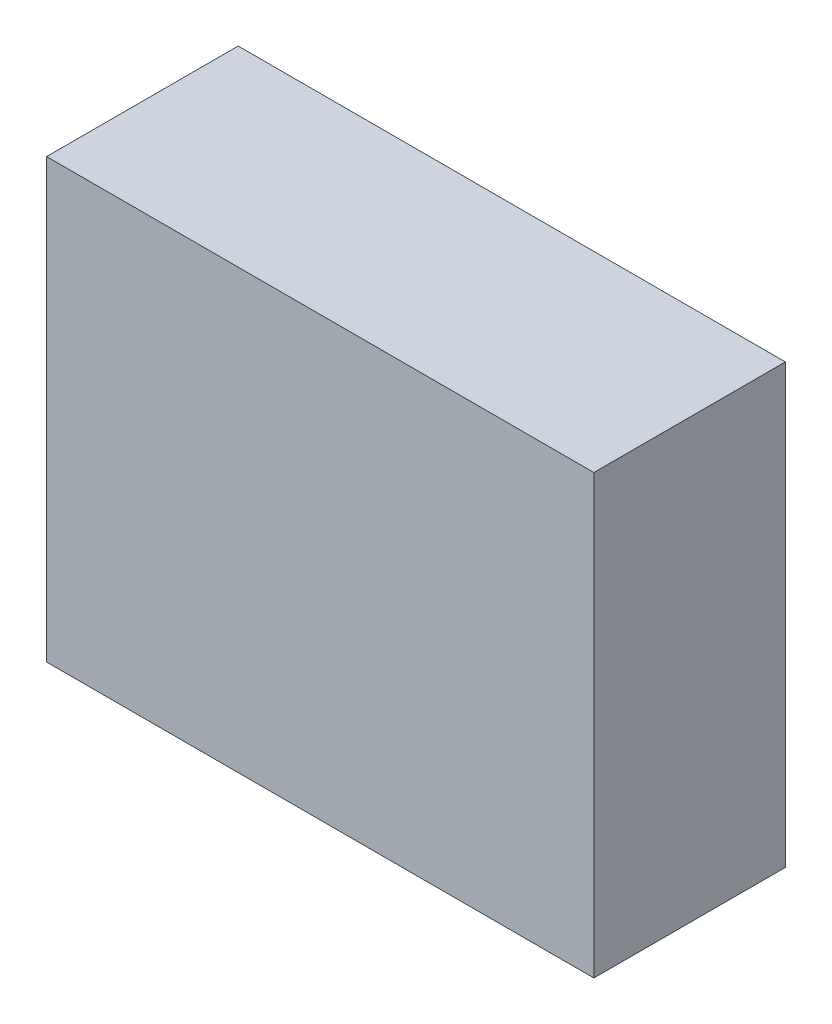
ISO-10303-21;
HEADER;
FILE_DESCRIPTION(('STEP AP214'),'2;1');
FILE_NAME('part.step','',(''),(''),'','','');
FILE_SCHEMA(('AUTOMOTIVE_DESIGN { 1 0 10303 214 1 1 1 1 }'));
ENDSEC;
DATA;
#1=APPLICATION_CONTEXT('core data for automotive mechanical design processes');
#2=APPLICATION_PROTOCOL_DEFINITION('international standard','automotive_design',2000,#1);
#3=PRODUCT_CONTEXT('',#1,'mechanical');
#4=PRODUCT('Part','Part','',(#3));
#5=PRODUCT_RELATED_PRODUCT_CATEGORY('part','',(#4));
#6=PRODUCT_DEFINITION_FORMATION('','',#4);
#7=PRODUCT_DEFINITION_CONTEXT('part definition',#1,'design');
#8=PRODUCT_DEFINITION('design','',#6,#7);
#9=PRODUCT_DEFINITION_SHAPE('','',#8);
#10=(LENGTH_UNIT() NAMED_UNIT(*) SI_UNIT(.MILLI.,.METRE.));
#11=(NAMED_UNIT(*) PLANE_ANGLE_UNIT() SI_UNIT($,.RADIAN.));
#12=(NAMED_UNIT(*) SI_UNIT($,.STERADIAN.) SOLID_ANGLE_UNIT());
#13=UNCERTAINTY_MEASURE_WITH_UNIT(LENGTH_MEASURE(1.E-05),#10,'distance_accuracy_value','');
#14=(GEOMETRIC_REPRESENTATION_CONTEXT(3) GLOBAL_UNCERTAINTY_ASSIGNED_CONTEXT((#13)) GLOBAL_UNIT_ASSIGNED_CONTEXT((#10,
#11,#12)) REPRESENTATION_CONTEXT('',''));
#15=CARTESIAN_POINT('',(0.,0.,0.));
#16=DIRECTION('',(0.,0.,1.));
#17=DIRECTION('',(1.,0.,0.));
#18=AXIS2_PLACEMENT_3D('',#15,#16,#17);
#19=CARTESIAN_POINT('',(10.,-2.,-20.8));
#20=DIRECTION('',(1.,0.,0.));
#21=DIRECTION('',(0.,0.,-1.));
#22=AXIS2_PLACEMENT_3D('',#19,#20,#21);
#23=PLANE('',#22);
#24=DIRECTION('',(0.,-1.,0.));
#25=VECTOR('',#24,1.);
#26=CARTESIAN_POINT('',(10.,-2.,-22.55));
#27=LINE('',#26,#25);
#28=CARTESIAN_POINT('',(10.,2.,-22.55));
#29=VERTEX_POINT('',#28);
#30=CARTESIAN_POINT('',(10.,-2.,-22.55));
#31=VERTEX_POINT('',#30);
#32=EDGE_CURVE('E105',#29,#31,#27,.T.);
#33=ORIENTED_EDGE('',*,*,#32,.T.);
#34=DIRECTION('',(0.,0.,-1.));
#35=VECTOR('',#34,1.);
#36=CARTESIAN_POINT('',(10.,-2.,-20.8));
#37=LINE('',#36,#35);
#38=CARTESIAN_POINT('',(10.,-2.,-20.8));
#39=VERTEX_POINT('',#38);
#40=EDGE_CURVE('E11',#39,#31,#37,.T.);
#41=ORIENTED_EDGE('',*,*,#40,.F.);
#42=DIRECTION('',(0.,-1.,0.));
#43=VECTOR('',#42,1.);
#44=CARTESIAN_POINT('',(10.,-2.,-20.8));
#45=LINE('',#44,#43);
#46=CARTESIAN_POINT('',(10.,2.,-20.8));
#47=VERTEX_POINT('',#46);
#48=EDGE_CURVE('E89',#47,#39,#45,.T.);
#49=ORIENTED_EDGE('',*,*,#48,.F.);
#50=DIRECTION('',(0.,0.,-1.));
#51=VECTOR('',#50,1.);
#52=CARTESIAN_POINT('',(10.,2.,-20.8));
#53=LINE('',#52,#51);
#54=EDGE_CURVE('E97',#47,#29,#53,.T.);
#55=ORIENTED_EDGE('',*,*,#54,.T.);
#56=EDGE_LOOP('',(#33,#41,#49,#55));
#57=FACE_BOUND('',#56,.T.);
#58=ADVANCED_FACE('F39',(#57),#23,.F.);
#59=CARTESIAN_POINT('',(10.,-2.,-20.8));
#60=DIRECTION('',(0.,1.,0.));
#61=DIRECTION('',(0.,0.,1.));
#62=AXIS2_PLACEMENT_3D('',#59,#60,#61);
#63=PLANE('',#62);
#64=DIRECTION('',(1.,0.,0.));
#65=VECTOR('',#64,1.);
#66=CARTESIAN_POINT('',(10.,-2.,-22.55));
#67=LINE('',#66,#65);
#68=CARTESIAN_POINT('',(15.,-2.,-22.55));
#69=VERTEX_POINT('',#68);
#70=EDGE_CURVE('E92',#31,#69,#67,.T.);
#71=ORIENTED_EDGE('',*,*,#70,.T.);
#72=DIRECTION('',(0.,0.,-1.));
#73=VECTOR('',#72,1.);
#74=CARTESIAN_POINT('',(15.,-2.,-20.8));
#75=LINE('',#74,#73);
#76=CARTESIAN_POINT('',(15.,-2.,-20.8));
#77=VERTEX_POINT('',#76);
#78=EDGE_CURVE('E50',#77,#69,#75,.T.);
#79=ORIENTED_EDGE('',*,*,#78,.F.);
#80=DIRECTION('',(1.,0.,0.));
#81=VECTOR('',#80,1.);
#82=CARTESIAN_POINT('',(10.,-2.,-20.8));
#83=LINE('',#82,#81);
#84=EDGE_CURVE('E82',#39,#77,#83,.T.);
#85=ORIENTED_EDGE('',*,*,#84,.F.);
#86=ORIENTED_EDGE('',*,*,#40,.T.);
#87=EDGE_LOOP('',(#71,#79,#85,#86));
#88=FACE_BOUND('',#87,.T.);
#89=ADVANCED_FACE('F93',(#88),#63,.F.);
#90=CARTESIAN_POINT('',(15.,-2.,-20.8));
#91=DIRECTION('',(-1.,0.,0.));
#92=DIRECTION('',(0.,0.,1.));
#93=AXIS2_PLACEMENT_3D('',#90,#91,#92);
#94=PLANE('',#93);
#95=DIRECTION('',(0.,1.,0.));
#96=VECTOR('',#95,1.);
#97=CARTESIAN_POINT('',(15.,-2.,-22.55));
#98=LINE('',#97,#96);
#99=CARTESIAN_POINT('',(15.,2.,-22.55));
#100=VERTEX_POINT('',#99);
#101=EDGE_CURVE('E74',#69,#100,#98,.T.);
#102=ORIENTED_EDGE('',*,*,#101,.T.);
#103=DIRECTION('',(0.,0.,-1.));
#104=VECTOR('',#103,1.);
#105=CARTESIAN_POINT('',(15.,2.,-20.8));
#106=LINE('',#105,#104);
#107=CARTESIAN_POINT('',(15.,2.,-20.8));
#108=VERTEX_POINT('',#107);
#109=EDGE_CURVE('E94',#108,#100,#106,.T.);
#110=ORIENTED_EDGE('',*,*,#109,.F.);
#111=DIRECTION('',(0.,1.,0.));
#112=VECTOR('',#111,1.);
#113=CARTESIAN_POINT('',(15.,-2.,-20.8));
#114=LINE('',#113,#112);
#115=EDGE_CURVE('E88',#77,#108,#114,.T.);
#116=ORIENTED_EDGE('',*,*,#115,.F.);
#117=ORIENTED_EDGE('',*,*,#78,.T.);
#118=EDGE_LOOP('',(#102,#110,#116,#117));
#119=FACE_BOUND('',#118,.T.);
#120=ADVANCED_FACE('F96',(#119),#94,.F.);
#121=CARTESIAN_POINT('',(10.,2.,-20.8));
#122=DIRECTION('',(0.,-1.,0.));
#123=DIRECTION('',(0.,0.,-1.));
#124=AXIS2_PLACEMENT_3D('',#121,#122,#123);
#125=PLANE('',#124);
#126=DIRECTION('',(-1.,0.,0.));
#127=VECTOR('',#126,1.);
#128=CARTESIAN_POINT('',(10.,2.,-22.55));
#129=LINE('',#128,#127);
#130=EDGE_CURVE('E76',#100,#29,#129,.T.);
#131=ORIENTED_EDGE('',*,*,#130,.T.);
#132=ORIENTED_EDGE('',*,*,#54,.F.);
#133=DIRECTION('',(-1.,0.,0.));
#134=VECTOR('',#133,1.);
#135=CARTESIAN_POINT('',(10.,2.,-20.8));
#136=LINE('',#135,#134);
#137=EDGE_CURVE('E54',#108,#47,#136,.T.);
#138=ORIENTED_EDGE('',*,*,#137,.F.);
#139=ORIENTED_EDGE('',*,*,#109,.T.);
#140=EDGE_LOOP('',(#131,#132,#138,#139));
#141=FACE_BOUND('',#140,.T.);
#142=ADVANCED_FACE('F106',(#141),#125,.F.);
#143=CARTESIAN_POINT('',(0.,0.,-20.8));
#144=DIRECTION('',(0.,0.,-1.));
#145=DIRECTION('',(-1.,0.,0.));
#146=AXIS2_PLACEMENT_3D('',#143,#144,#145);
#147=PLANE('',#146);
#148=ORIENTED_EDGE('',*,*,#48,.T.);
#149=ORIENTED_EDGE('',*,*,#84,.T.);
#150=ORIENTED_EDGE('',*,*,#115,.T.);
#151=ORIENTED_EDGE('',*,*,#137,.T.);
#152=EDGE_LOOP('',(#148,#149,#150,#151));
#153=FACE_BOUND('',#152,.T.);
#154=ADVANCED_FACE('F86',(#153),#147,.F.);
#155=CARTESIAN_POINT('',(0.,0.,-22.55));
#156=DIRECTION('',(0.,0.,-1.));
#157=DIRECTION('',(-1.,0.,0.));
#158=AXIS2_PLACEMENT_3D('',#155,#156,#157);
#159=PLANE('',#158);
#160=ORIENTED_EDGE('',*,*,#32,.F.);
#161=ORIENTED_EDGE('',*,*,#130,.F.);
#162=ORIENTED_EDGE('',*,*,#101,.F.);
#163=ORIENTED_EDGE('',*,*,#70,.F.);
#164=EDGE_LOOP('',(#160,#161,#162,#163));
#165=FACE_BOUND('',#164,.T.);
#166=ADVANCED_FACE('F115',(#165),#159,.T.);
#167=CLOSED_SHELL('',(#58,#89,#120,#142,#154,#166));
#168=MANIFOLD_SOLID_BREP('B2',#167);
#169=ADVANCED_BREP_SHAPE_REPRESENTATION('',(#18,#168),#14);
#170=SHAPE_DEFINITION_REPRESENTATION(#9,#169);
ENDSEC;
END-ISO-10303-21;
